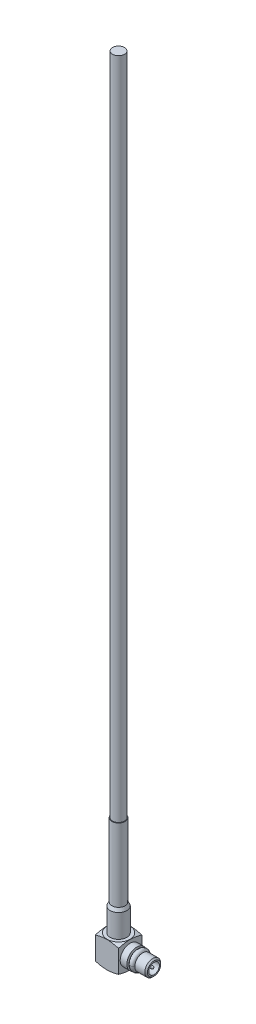
ISO-10303-21;
HEADER;
FILE_DESCRIPTION(('STEP AP214'),'2;1');
FILE_NAME('part.step','',(''),(''),'','','');
FILE_SCHEMA(('AUTOMOTIVE_DESIGN { 1 0 10303 214 1 1 1 1 }'));
ENDSEC;
DATA;
#1=APPLICATION_CONTEXT('core data for automotive mechanical design processes');
#2=APPLICATION_PROTOCOL_DEFINITION('international standard','automotive_design',2000,#1);
#3=PRODUCT_CONTEXT('',#1,'mechanical');
#4=PRODUCT('Part','Part','',(#3));
#5=PRODUCT_RELATED_PRODUCT_CATEGORY('part','',(#4));
#6=PRODUCT_DEFINITION_FORMATION('','',#4);
#7=PRODUCT_DEFINITION_CONTEXT('part definition',#1,'design');
#8=PRODUCT_DEFINITION('design','',#6,#7);
#9=PRODUCT_DEFINITION_SHAPE('','',#8);
#10=(LENGTH_UNIT() NAMED_UNIT(*) SI_UNIT(.MILLI.,.METRE.));
#11=(NAMED_UNIT(*) PLANE_ANGLE_UNIT() SI_UNIT($,.RADIAN.));
#12=(NAMED_UNIT(*) SI_UNIT($,.STERADIAN.) SOLID_ANGLE_UNIT());
#13=UNCERTAINTY_MEASURE_WITH_UNIT(LENGTH_MEASURE(1.E-05),#10,'distance_accuracy_value','');
#14=(GEOMETRIC_REPRESENTATION_CONTEXT(3) GLOBAL_UNCERTAINTY_ASSIGNED_CONTEXT((#13)) GLOBAL_UNIT_ASSIGNED_CONTEXT((#10,
#11,#12)) REPRESENTATION_CONTEXT('',''));
#15=CARTESIAN_POINT('',(0.,0.,0.));
#16=DIRECTION('',(0.,0.,1.));
#17=DIRECTION('',(1.,0.,0.));
#18=AXIS2_PLACEMENT_3D('',#15,#16,#17);
#19=CARTESIAN_POINT('',(5.05,2.,0.));
#20=DIRECTION('',(0.,0.,1.));
#21=DIRECTION('',(-1.,0.,0.));
#22=AXIS2_PLACEMENT_3D('',#19,#20,#21);
#23=SPHERICAL_SURFACE('',#22,0.2);
#24=CARTESIAN_POINT('',(5.05,2.,0.));
#25=DIRECTION('',(-1.,0.,0.));
#26=DIRECTION('',(0.,0.,1.));
#27=AXIS2_PLACEMENT_3D('',#24,#25,#26);
#28=CIRCLE('',#27,0.2);
#29=CARTESIAN_POINT('',(5.05,1.99999999993847,-0.2));
#30=VERTEX_POINT('',#29);
#31=CARTESIAN_POINT('',(5.05,1.99999999999102,0.2));
#32=VERTEX_POINT('',#31);
#33=EDGE_CURVE('E262',#30,#32,#28,.F.);
#34=ORIENTED_EDGE('',*,*,#33,.T.);
#35=CARTESIAN_POINT('',(5.05,2.,0.));
#36=DIRECTION('',(-1.,0.,0.));
#37=DIRECTION('',(0.,0.,1.));
#38=AXIS2_PLACEMENT_3D('',#35,#36,#37);
#39=CIRCLE('',#38,0.2);
#40=EDGE_CURVE('E150',#32,#30,#39,.F.);
#41=ORIENTED_EDGE('',*,*,#40,.T.);
#42=EDGE_LOOP('',(#34,#41));
#43=FACE_BOUND('',#42,.T.);
#44=ADVANCED_FACE('F17',(#43),#23,.T.);
#45=CARTESIAN_POINT('',(5.05,2.,0.));
#46=DIRECTION('',(-1.,0.,0.));
#47=DIRECTION('',(0.,-1.,0.));
#48=AXIS2_PLACEMENT_3D('',#45,#46,#47);
#49=CYLINDRICAL_SURFACE('',#48,0.2);
#50=CARTESIAN_POINT('',(3.85,2.,0.));
#51=DIRECTION('',(-1.,0.,0.));
#52=DIRECTION('',(0.,-1.,0.));
#53=AXIS2_PLACEMENT_3D('',#50,#51,#52);
#54=CIRCLE('',#53,0.2);
#55=CARTESIAN_POINT('',(3.85,1.8,0.));
#56=VERTEX_POINT('',#55);
#57=EDGE_CURVE('E21',#56,#56,#54,.T.);
#58=ORIENTED_EDGE('',*,*,#57,.F.);
#59=EDGE_LOOP('',(#58));
#60=FACE_BOUND('',#59,.T.);
#61=ORIENTED_EDGE('',*,*,#33,.F.);
#62=ORIENTED_EDGE('',*,*,#40,.F.);
#63=EDGE_LOOP('',(#61,#62));
#64=FACE_BOUND('',#63,.T.);
#65=ADVANCED_FACE('F156',(#60,#64),#49,.T.);
#66=CARTESIAN_POINT('',(3.85,1.1904,0.8096));
#67=DIRECTION('',(1.,0.,0.));
#68=DIRECTION('',(0.,0.,-1.));
#69=AXIS2_PLACEMENT_3D('',#66,#67,#68);
#70=PLANE('',#69);
#71=ORIENTED_EDGE('',*,*,#57,.T.);
#72=EDGE_LOOP('',(#71));
#73=FACE_BOUND('',#72,.T.);
#74=CARTESIAN_POINT('',(3.85,2.,0.));
#75=DIRECTION('',(1.,0.,0.));
#76=DIRECTION('',(0.,1.,0.));
#77=AXIS2_PLACEMENT_3D('',#74,#75,#76);
#78=CIRCLE('',#77,0.8);
#79=CARTESIAN_POINT('',(3.85,2.8,0.));
#80=VERTEX_POINT('',#79);
#81=EDGE_CURVE('E269',#80,#80,#78,.F.);
#82=ORIENTED_EDGE('',*,*,#81,.F.);
#83=EDGE_LOOP('',(#82));
#84=FACE_BOUND('',#83,.T.);
#85=ADVANCED_FACE('F159',(#73,#84),#70,.T.);
#86=CARTESIAN_POINT('',(3.85,2.,0.));
#87=DIRECTION('',(1.,0.,0.));
#88=DIRECTION('',(0.,1.,0.));
#89=AXIS2_PLACEMENT_3D('',#86,#87,#88);
#90=CYLINDRICAL_SURFACE('',#89,0.8);
#91=CARTESIAN_POINT('',(5.35,2.,0.));
#92=DIRECTION('',(1.,0.,0.));
#93=DIRECTION('',(0.,1.,0.));
#94=AXIS2_PLACEMENT_3D('',#91,#92,#93);
#95=CIRCLE('',#94,0.8);
#96=CARTESIAN_POINT('',(5.35,2.8,0.));
#97=VERTEX_POINT('',#96);
#98=EDGE_CURVE('E534',#97,#97,#95,.F.);
#99=ORIENTED_EDGE('',*,*,#98,.F.);
#100=EDGE_LOOP('',(#99));
#101=FACE_BOUND('',#100,.T.);
#102=ORIENTED_EDGE('',*,*,#81,.T.);
#103=EDGE_LOOP('',(#102));
#104=FACE_BOUND('',#103,.T.);
#105=ADVANCED_FACE('F162',(#101,#104),#90,.F.);
#106=CARTESIAN_POINT('',(5.35,0.988,1.012));
#107=DIRECTION('',(1.,0.,0.));
#108=DIRECTION('',(0.,0.,-1.));
#109=AXIS2_PLACEMENT_3D('',#106,#107,#108);
#110=PLANE('',#109);
#111=ORIENTED_EDGE('',*,*,#98,.T.);
#112=EDGE_LOOP('',(#111));
#113=FACE_BOUND('',#112,.T.);
#114=CARTESIAN_POINT('',(5.34999999999997,2.,0.));
#115=DIRECTION('',(-1.,0.,0.));
#116=DIRECTION('',(0.,0.,1.));
#117=AXIS2_PLACEMENT_3D('',#114,#115,#116);
#118=CIRCLE('',#117,1.00000000000003);
#119=CARTESIAN_POINT('',(5.34999999999997,2.,1.00000000000003));
#120=VERTEX_POINT('',#119);
#121=EDGE_CURVE('E147',#120,#120,#118,.F.);
#122=ORIENTED_EDGE('',*,*,#121,.T.);
#123=EDGE_LOOP('',(#122));
#124=FACE_BOUND('',#123,.T.);
#125=ADVANCED_FACE('F164',(#113,#124),#110,.T.);
#126=CARTESIAN_POINT('',(5.35,2.,0.));
#127=DIRECTION('',(-1.,0.,0.));
#128=DIRECTION('',(0.,0.,1.));
#129=AXIS2_PLACEMENT_3D('',#126,#127,#128);
#130=CONICAL_SURFACE('',#129,1.,0.785398163397447);
#131=ORIENTED_EDGE('',*,*,#121,.F.);
#132=EDGE_LOOP('',(#131));
#133=FACE_BOUND('',#132,.T.);
#134=CARTESIAN_POINT('',(5.15,2.,0.));
#135=DIRECTION('',(-1.,0.,0.));
#136=DIRECTION('',(0.,0.,1.));
#137=AXIS2_PLACEMENT_3D('',#134,#135,#136);
#138=CIRCLE('',#137,1.2);
#139=CARTESIAN_POINT('',(5.15,2.,1.2));
#140=VERTEX_POINT('',#139);
#141=EDGE_CURVE('E143',#140,#140,#138,.F.);
#142=ORIENTED_EDGE('',*,*,#141,.T.);
#143=EDGE_LOOP('',(#142));
#144=FACE_BOUND('',#143,.T.);
#145=ADVANCED_FACE('F167',(#133,#144),#130,.T.);
#146=CARTESIAN_POINT('',(5.15,2.,0.));
#147=DIRECTION('',(-1.,0.,0.));
#148=DIRECTION('',(0.,-1.,0.));
#149=AXIS2_PLACEMENT_3D('',#146,#147,#148);
#150=CYLINDRICAL_SURFACE('',#149,1.2);
#151=ORIENTED_EDGE('',*,*,#141,.F.);
#152=EDGE_LOOP('',(#151));
#153=FACE_BOUND('',#152,.T.);
#154=CARTESIAN_POINT('',(3.65,2.,0.));
#155=DIRECTION('',(-1.,0.,0.));
#156=DIRECTION('',(0.,-1.,0.));
#157=AXIS2_PLACEMENT_3D('',#154,#155,#156);
#158=CIRCLE('',#157,1.2);
#159=CARTESIAN_POINT('',(3.65,0.8,0.));
#160=VERTEX_POINT('',#159);
#161=EDGE_CURVE('E146',#160,#160,#158,.F.);
#162=ORIENTED_EDGE('',*,*,#161,.T.);
#163=EDGE_LOOP('',(#162));
#164=FACE_BOUND('',#163,.T.);
#165=ADVANCED_FACE('F173',(#153,#164),#150,.T.);
#166=CARTESIAN_POINT('',(3.65,0.7856,1.2144));
#167=DIRECTION('',(1.,0.,0.));
#168=DIRECTION('',(0.,0.,-1.));
#169=AXIS2_PLACEMENT_3D('',#166,#167,#168);
#170=PLANE('',#169);
#171=CARTESIAN_POINT('',(3.65,2.,0.));
#172=DIRECTION('',(-1.,0.,0.));
#173=DIRECTION('',(0.,0.,1.));
#174=AXIS2_PLACEMENT_3D('',#171,#172,#173);
#175=CIRCLE('',#174,1.);
#176=CARTESIAN_POINT('',(3.65,2.,1.));
#177=VERTEX_POINT('',#176);
#178=EDGE_CURVE('E136',#177,#177,#175,.F.);
#179=ORIENTED_EDGE('',*,*,#178,.T.);
#180=EDGE_LOOP('',(#179));
#181=FACE_BOUND('',#180,.T.);
#182=ORIENTED_EDGE('',*,*,#161,.F.);
#183=EDGE_LOOP('',(#182));
#184=FACE_BOUND('',#183,.T.);
#185=ADVANCED_FACE('F169',(#181,#184),#170,.F.);
#186=CARTESIAN_POINT('',(3.65,2.,0.));
#187=DIRECTION('',(-1.,0.,0.));
#188=DIRECTION('',(0.,0.,1.));
#189=AXIS2_PLACEMENT_3D('',#186,#187,#188);
#190=CYLINDRICAL_SURFACE('',#189,1.);
#191=CARTESIAN_POINT('',(3.56918829912818,2.,0.));
#192=DIRECTION('',(-1.,0.,0.));
#193=DIRECTION('',(0.,-1.,0.));
#194=AXIS2_PLACEMENT_3D('',#191,#192,#193);
#195=CIRCLE('',#194,1.00000000011661);
#196=CARTESIAN_POINT('',(3.56918829909613,2.,1.00000000008745));
#197=VERTEX_POINT('',#196);
#198=CARTESIAN_POINT('',(3.56918829909613,1.99999999989745,-1.00000000008745));
#199=VERTEX_POINT('',#198);
#200=EDGE_CURVE('E111',#197,#199,#195,.T.);
#201=ORIENTED_EDGE('',*,*,#200,.F.);
#202=CARTESIAN_POINT('',(3.56918829912818,2.,0.));
#203=DIRECTION('',(-1.,0.,0.));
#204=DIRECTION('',(0.,-1.,0.));
#205=AXIS2_PLACEMENT_3D('',#202,#203,#204);
#206=CIRCLE('',#205,1.00000000011661);
#207=EDGE_CURVE('E130',#199,#197,#206,.T.);
#208=ORIENTED_EDGE('',*,*,#207,.F.);
#209=EDGE_LOOP('',(#201,#208));
#210=FACE_BOUND('',#209,.T.);
#211=ORIENTED_EDGE('',*,*,#178,.F.);
#212=EDGE_LOOP('',(#211));
#213=FACE_BOUND('',#212,.T.);
#214=ADVANCED_FACE('F172',(#210,#213),#190,.T.);
#215=CARTESIAN_POINT('',(2.841641112,2.,-0.963592296));
#216=CARTESIAN_POINT('',(2.841641112,0.072815408,-0.963592296));
#217=CARTESIAN_POINT('',(2.841641112,0.072815408,0.963592296));
#218=CARTESIAN_POINT('',(2.841641112,2.,0.963592296));
#219=CARTESIAN_POINT('',(2.745890609,2.,-1.235039707));
#220=CARTESIAN_POINT('',(2.745890609,-0.470079413,-1.235039707));
#221=CARTESIAN_POINT('',(2.745890609,-0.470079413,1.235039707));
#222=CARTESIAN_POINT('',(2.745890609,2.,1.235039707));
#223=CARTESIAN_POINT('',(2.912160017,2.,-1.47));
#224=CARTESIAN_POINT('',(2.912160017,-0.94,-1.47));
#225=CARTESIAN_POINT('',(2.912160017,-0.94,1.47));
#226=CARTESIAN_POINT('',(2.912160017,2.,1.47));
#227=CARTESIAN_POINT('',(3.2,2.,-1.47));
#228=CARTESIAN_POINT('',(3.2,-0.94,-1.47));
#229=CARTESIAN_POINT('',(3.2,-0.94,1.47));
#230=CARTESIAN_POINT('',(3.2,2.,1.47));
#231=CARTESIAN_POINT('',(3.487839983,2.,-1.47));
#232=CARTESIAN_POINT('',(3.487839983,-0.94,-1.47));
#233=CARTESIAN_POINT('',(3.487839983,-0.94,1.47));
#234=CARTESIAN_POINT('',(3.487839983,2.,1.47));
#235=CARTESIAN_POINT('',(3.654109391,2.,-1.235039707));
#236=CARTESIAN_POINT('',(3.654109391,-0.470079413,-1.235039707));
#237=CARTESIAN_POINT('',(3.654109391,-0.470079413,1.235039707));
#238=CARTESIAN_POINT('',(3.654109391,2.,1.235039707));
#239=CARTESIAN_POINT('',(3.558358888,2.,-0.963592296));
#240=CARTESIAN_POINT('',(3.558358888,0.072815408,-0.963592296));
#241=CARTESIAN_POINT('',(3.558358888,0.072815408,0.963592296));
#242=CARTESIAN_POINT('',(3.558358888,2.,0.963592296));
#243=(BOUNDED_SURFACE() B_SPLINE_SURFACE(3,3,((#215,#216,#217,#218),(#219,#220,#221,#222),(#223,
#224,#225,#226),(#227,#228,#229,#230),(#231,#232,#233,#234),(#235,#236,#237,#238),(#239,#240,
#241,#242)),.UNSPECIFIED.,.F.,.F.,.F.) B_SPLINE_SURFACE_WITH_KNOTS((4,3,4),(4,4),(0.,0.5,1.),
(0.,1.),.UNSPECIFIED.) GEOMETRIC_REPRESENTATION_ITEM() RATIONAL_B_SPLINE_SURFACE(((1.,
0.333333333333333,0.333333333333333,1.),(0.71843018897567,0.239476729658557,0.239476729658557,
0.71843018897567),(0.71843018897567,0.239476729658557,0.239476729658557,0.71843018897567),(1.,
0.333333333333333,0.333333333333333,1.),(0.71843018897567,0.239476729658557,0.239476729658557,
0.71843018897567),(0.71843018897567,0.239476729658557,0.239476729658557,0.71843018897567),(1.,
0.333333333333333,0.333333333333333,1.))) REPRESENTATION_ITEM('') SURFACE());
#244=CARTESIAN_POINT('',(2.841641112,2.,0.963592296));
#245=CARTESIAN_POINT('',(2.745890609,2.,1.235039707));
#246=CARTESIAN_POINT('',(2.912160017,2.,1.47));
#247=CARTESIAN_POINT('',(3.2,2.,1.47));
#248=CARTESIAN_POINT('',(3.487839983,2.,1.47));
#249=CARTESIAN_POINT('',(3.654109391,2.,1.235039707));
#250=CARTESIAN_POINT('',(3.558358888,2.,0.963592296));
#251=(BOUNDED_CURVE() B_SPLINE_CURVE(3,(#244,#245,#246,#247,#248,#249,#250),.UNSPECIFIED.,.F.,
.F.) B_SPLINE_CURVE_WITH_KNOTS((4,3,4),(0.,0.5,1.),
.UNSPECIFIED.) CURVE() GEOMETRIC_REPRESENTATION_ITEM() RATIONAL_B_SPLINE_CURVE((1.,
0.71843018897567,0.71843018897567,1.,0.71843018897567,0.71843018897567,1.)) REPRESENTATION_ITEM(''));
#252=CARTESIAN_POINT('',(2.83081170097646,1.9999999999551,0.999999999994262));
#253=VERTEX_POINT('',#252);
#254=EDGE_CURVE('E105',#253,#197,#251,.T.);
#255=CARTESIAN_POINT('',(2.830811701,2.,0.));
#256=DIRECTION('',(-1.,0.,0.));
#257=DIRECTION('',(0.,0.,1.));
#258=AXIS2_PLACEMENT_3D('',#255,#256,#257);
#259=CIRCLE('',#258,1.);
#260=CARTESIAN_POINT('',(2.83081170097646,1.99999999969234,-0.999999999994262));
#261=VERTEX_POINT('',#260);
#262=EDGE_CURVE('E101',#253,#261,#259,.F.);
#263=CARTESIAN_POINT('',(2.841641112,2.,-0.963592296));
#264=CARTESIAN_POINT('',(2.745890609,2.,-1.235039707));
#265=CARTESIAN_POINT('',(2.912160017,2.,-1.47));
#266=CARTESIAN_POINT('',(3.2,2.,-1.47));
#267=CARTESIAN_POINT('',(3.487839983,2.,-1.47));
#268=CARTESIAN_POINT('',(3.654109391,2.,-1.235039707));
#269=CARTESIAN_POINT('',(3.558358888,2.,-0.963592296));
#270=(BOUNDED_CURVE() B_SPLINE_CURVE(3,(#263,#264,#265,#266,#267,#268,#269),.UNSPECIFIED.,.F.,
.F.) B_SPLINE_CURVE_WITH_KNOTS((4,3,4),(0.,0.5,1.),
.UNSPECIFIED.) CURVE() GEOMETRIC_REPRESENTATION_ITEM() RATIONAL_B_SPLINE_CURVE((1.,
0.71843018897567,0.71843018897567,1.,0.71843018897567,0.71843018897567,1.)) REPRESENTATION_ITEM(''));
#271=EDGE_CURVE('E108',#199,#261,#270,.F.);
#272=ORIENTED_EDGE('',*,*,#254,.F.);
#273=ORIENTED_EDGE('',*,*,#262,.T.);
#274=ORIENTED_EDGE('',*,*,#271,.F.);
#275=ORIENTED_EDGE('',*,*,#207,.T.);
#276=EDGE_LOOP('',(#272,#273,#274,#275));
#277=FACE_BOUND('',#276,.T.);
#278=ADVANCED_FACE('F430',(#277),#243,.T.);
#279=CARTESIAN_POINT('',(2.841641112,2.,0.963592296));
#280=CARTESIAN_POINT('',(2.841641112,3.927184592,0.963592296));
#281=CARTESIAN_POINT('',(2.841641112,3.927184592,-0.963592296));
#282=CARTESIAN_POINT('',(2.841641112,2.,-0.963592296));
#283=CARTESIAN_POINT('',(2.745890609,2.,1.235039707));
#284=CARTESIAN_POINT('',(2.745890609,4.470079413,1.235039707));
#285=CARTESIAN_POINT('',(2.745890609,4.470079413,-1.235039707));
#286=CARTESIAN_POINT('',(2.745890609,2.,-1.235039707));
#287=CARTESIAN_POINT('',(2.912160017,2.,1.47));
#288=CARTESIAN_POINT('',(2.912160017,4.94,1.47));
#289=CARTESIAN_POINT('',(2.912160017,4.94,-1.47));
#290=CARTESIAN_POINT('',(2.912160017,2.,-1.47));
#291=CARTESIAN_POINT('',(3.2,2.,1.47));
#292=CARTESIAN_POINT('',(3.2,4.94,1.47));
#293=CARTESIAN_POINT('',(3.2,4.94,-1.47));
#294=CARTESIAN_POINT('',(3.2,2.,-1.47));
#295=CARTESIAN_POINT('',(3.487839983,2.,1.47));
#296=CARTESIAN_POINT('',(3.487839983,4.94,1.47));
#297=CARTESIAN_POINT('',(3.487839983,4.94,-1.47));
#298=CARTESIAN_POINT('',(3.487839983,2.,-1.47));
#299=CARTESIAN_POINT('',(3.654109391,2.,1.235039707));
#300=CARTESIAN_POINT('',(3.654109391,4.470079413,1.235039707));
#301=CARTESIAN_POINT('',(3.654109391,4.470079413,-1.235039707));
#302=CARTESIAN_POINT('',(3.654109391,2.,-1.235039707));
#303=CARTESIAN_POINT('',(3.558358888,2.,0.963592296));
#304=CARTESIAN_POINT('',(3.558358888,3.927184592,0.963592296));
#305=CARTESIAN_POINT('',(3.558358888,3.927184592,-0.963592296));
#306=CARTESIAN_POINT('',(3.558358888,2.,-0.963592296));
#307=(BOUNDED_SURFACE() B_SPLINE_SURFACE(3,3,((#279,#280,#281,#282),(#283,#284,#285,#286),(#287,
#288,#289,#290),(#291,#292,#293,#294),(#295,#296,#297,#298),(#299,#300,#301,#302),(#303,#304,
#305,#306)),.UNSPECIFIED.,.F.,.F.,.F.) B_SPLINE_SURFACE_WITH_KNOTS((4,3,4),(4,4),(0.,0.5,1.),
(0.,1.),.UNSPECIFIED.) GEOMETRIC_REPRESENTATION_ITEM() RATIONAL_B_SPLINE_SURFACE(((1.,
0.333333333333333,0.333333333333333,1.),(0.71843018897567,0.239476729658557,0.239476729658557,
0.71843018897567),(0.71843018897567,0.239476729658557,0.239476729658557,0.71843018897567),(1.,
0.333333333333333,0.333333333333333,1.),(0.71843018897567,0.239476729658557,0.239476729658557,
0.71843018897567),(0.71843018897567,0.239476729658557,0.239476729658557,0.71843018897567),(1.,
0.333333333333333,0.333333333333333,1.))) REPRESENTATION_ITEM('') SURFACE());
#308=CARTESIAN_POINT('',(2.830811701,2.,0.));
#309=DIRECTION('',(-1.,0.,0.));
#310=DIRECTION('',(0.,0.,1.));
#311=AXIS2_PLACEMENT_3D('',#308,#309,#310);
#312=CIRCLE('',#311,1.);
#313=EDGE_CURVE('E104',#261,#253,#312,.F.);
#314=ORIENTED_EDGE('',*,*,#313,.T.);
#315=ORIENTED_EDGE('',*,*,#254,.T.);
#316=ORIENTED_EDGE('',*,*,#200,.T.);
#317=ORIENTED_EDGE('',*,*,#271,.T.);
#318=EDGE_LOOP('',(#314,#315,#316,#317));
#319=FACE_BOUND('',#318,.T.);
#320=ADVANCED_FACE('F422',(#319),#307,.T.);
#321=CARTESIAN_POINT('',(2.830811701,2.,0.));
#322=DIRECTION('',(-1.,0.,0.));
#323=DIRECTION('',(0.,0.,1.));
#324=AXIS2_PLACEMENT_3D('',#321,#322,#323);
#325=CYLINDRICAL_SURFACE('',#324,1.);
#326=CARTESIAN_POINT('',(2.75,2.,0.));
#327=DIRECTION('',(-1.,0.,0.));
#328=DIRECTION('',(0.,0.,1.));
#329=AXIS2_PLACEMENT_3D('',#326,#327,#328);
#330=CIRCLE('',#329,1.);
#331=CARTESIAN_POINT('',(2.75,2.,1.));
#332=VERTEX_POINT('',#331);
#333=EDGE_CURVE('E121',#332,#332,#330,.T.);
#334=ORIENTED_EDGE('',*,*,#333,.F.);
#335=EDGE_LOOP('',(#334));
#336=FACE_BOUND('',#335,.T.);
#337=ORIENTED_EDGE('',*,*,#313,.F.);
#338=ORIENTED_EDGE('',*,*,#262,.F.);
#339=EDGE_LOOP('',(#337,#338));
#340=FACE_BOUND('',#339,.T.);
#341=ADVANCED_FACE('F179',(#336,#340),#325,.T.);
#342=CARTESIAN_POINT('',(2.75,0.482,1.518));
#343=DIRECTION('',(1.,0.,0.));
#344=DIRECTION('',(0.,0.,-1.));
#345=AXIS2_PLACEMENT_3D('',#342,#343,#344);
#346=PLANE('',#345);
#347=ORIENTED_EDGE('',*,*,#333,.T.);
#348=EDGE_LOOP('',(#347));
#349=FACE_BOUND('',#348,.T.);
#350=CARTESIAN_POINT('',(2.75,2.,0.));
#351=DIRECTION('',(-1.,0.,0.));
#352=DIRECTION('',(0.,0.,1.));
#353=AXIS2_PLACEMENT_3D('',#350,#351,#352);
#354=CIRCLE('',#353,1.5);
#355=CARTESIAN_POINT('',(2.75,2.,1.5));
#356=VERTEX_POINT('',#355);
#357=EDGE_CURVE('E547',#356,#356,#354,.F.);
#358=ORIENTED_EDGE('',*,*,#357,.T.);
#359=EDGE_LOOP('',(#358));
#360=FACE_BOUND('',#359,.T.);
#361=ADVANCED_FACE('F175',(#349,#360),#346,.T.);
#362=CARTESIAN_POINT('',(-1.745572219,0.,-1.745572219));
#363=DIRECTION('',(0.,1.,0.));
#364=DIRECTION('',(0.,0.,1.));
#365=AXIS2_PLACEMENT_3D('',#362,#363,#364);
#366=PLANE('',#365);
#367=CARTESIAN_POINT('',(0.,-4.18998275203259E-10,0.));
#368=DIRECTION('',(0.,1.,0.));
#369=DIRECTION('',(0.,0.,1.));
#370=AXIS2_PLACEMENT_3D('',#367,#368,#369);
#371=CIRCLE('',#370,1.72487373429371);
#372=CARTESIAN_POINT('',(0.,-4.18998275203259E-10,1.72487373429371));
#373=VERTEX_POINT('',#372);
#374=EDGE_CURVE('E81',#373,#373,#371,.F.);
#375=ORIENTED_EDGE('',*,*,#374,.T.);
#376=EDGE_LOOP('',(#375));
#377=FACE_BOUND('',#376,.T.);
#378=ADVANCED_FACE('F178',(#377),#366,.F.);
#379=CARTESIAN_POINT('',(2.75,2.,0.));
#380=DIRECTION('',(-1.,0.,0.));
#381=DIRECTION('',(0.,0.,1.));
#382=AXIS2_PLACEMENT_3D('',#379,#380,#381);
#383=CYLINDRICAL_SURFACE('',#382,1.5);
#384=ORIENTED_EDGE('',*,*,#357,.F.);
#385=EDGE_LOOP('',(#384));
#386=FACE_BOUND('',#385,.T.);
#387=CARTESIAN_POINT('',(1.75,2.,0.));
#388=DIRECTION('',(-1.,0.,0.));
#389=DIRECTION('',(0.,0.,1.));
#390=AXIS2_PLACEMENT_3D('',#387,#388,#389);
#391=CIRCLE('',#390,1.5);
#392=CARTESIAN_POINT('',(1.75,2.,1.5));
#393=VERTEX_POINT('',#392);
#394=EDGE_CURVE('E95',#393,#393,#391,.F.);
#395=ORIENTED_EDGE('',*,*,#394,.T.);
#396=EDGE_LOOP('',(#395));
#397=FACE_BOUND('',#396,.T.);
#398=ADVANCED_FACE('F183',(#386,#397),#383,.T.);
#399=CARTESIAN_POINT('',(0.,-4.18991162836994E-10,0.));
#400=DIRECTION('',(0.,1.,0.));
#401=DIRECTION('',(0.,0.,1.));
#402=AXIS2_PLACEMENT_3D('',#399,#400,#401);
#403=CONICAL_SURFACE('',#402,1.72487373429373,1.19028994906997);
#404=CARTESIAN_POINT('',(-1.75000000005264,0.300000000001926,1.74999999995095));
#405=CARTESIAN_POINT('',(-1.75000000001891,0.277343892377994,1.66984025484135));
#406=CARTESIAN_POINT('',(-1.75000000000507,0.255376495742548,1.58947507055314));
#407=CARTESIAN_POINT('',(-1.74999999999493,0.213250057796904,1.42822964975774));
#408=CARTESIAN_POINT('',(-1.74999999999864,0.193091953293528,1.34734916938965));
#409=CARTESIAN_POINT('',(-1.75000000000137,0.154929292887335,1.18458232255644));
#410=CARTESIAN_POINT('',(-1.75000000000037,0.136937858724414,1.10269284413399));
#411=CARTESIAN_POINT('',(-1.74999999999963,0.103820651591177,0.938340482380735));
#412=CARTESIAN_POINT('',(-1.7499999999999,0.0886945065931123,0.855877674934067));
#413=CARTESIAN_POINT('',(-1.75000000000009,0.0623358238787216,0.692802059846125));
#414=CARTESIAN_POINT('',(-1.75000000000003,0.0510021973246043,0.612205832563477));
#415=CARTESIAN_POINT('',(-1.74999999999998,0.0322176998984324,0.450564347562989));
#416=CARTESIAN_POINT('',(-1.74999999999999,0.0247663273961863,0.36951914922551));
#417=CARTESIAN_POINT('',(-1.75000000000001,0.0142241930304569,0.207366130271185));
#418=CARTESIAN_POINT('',(-1.75,0.0111213074862501,0.126259117092636));
#419=CARTESIAN_POINT('',(-1.75,0.00944519765535009,-0.0359956845704734));
#420=CARTESIAN_POINT('',(-1.75,0.010871770195776,-0.117143471062859));
#421=CARTESIAN_POINT('',(-1.75,0.0203844175750047,-0.328165376810296));
#422=CARTESIAN_POINT('',(-1.75,0.0319700791483235,-0.457889301824149));
#423=CARTESIAN_POINT('',(-1.75,0.0648175785507928,-0.716321982760633));
#424=CARTESIAN_POINT('',(-1.75,0.0861005791351572,-0.84502788877007));
#425=CARTESIAN_POINT('',(-1.75,0.13646744692654,-1.10417382883707));
#426=CARTESIAN_POINT('',(-1.75,0.165731382352873,-1.23457791882599));
#427=CARTESIAN_POINT('',(-1.75,0.213527538837027,-1.42890603289927));
#428=CARTESIAN_POINT('',(-1.75,0.230070706517323,-1.49333466666709));
#429=CARTESIAN_POINT('',(-1.75,0.264259350602957,-1.62188453921529));
#430=CARTESIAN_POINT('',(-1.75,0.281904588452892,-1.6860058413076));
#431=CARTESIAN_POINT('',(-1.75,0.300000000043209,-1.74999999994909));
#432=B_SPLINE_CURVE_WITH_KNOTS('',3,(#404,#405,#406,#407,#408,#409,#410,#411,#412,#413,#414,
#415,#416,#417,#418,#419,#420,#421,#422,#423,#424,#425,#426,#427,#428,#429,#430,#431),
.UNSPECIFIED.,.F.,.F.,(4,2,2,2,2,2,2,2,2,2,2,2,2,4),(0.,0.249912407687991,0.49995347625099,
0.751439863802241,1.00289357606844,1.24698038116211,1.49103563971256,1.73440910374937,
1.97777165120669,2.368011002196,2.75910609209306,3.15988275266041,3.3594320302765,
3.55893826192699),.UNSPECIFIED.);
#433=CARTESIAN_POINT('',(-1.74999999997,0.300000000040639,1.74999999997));
#434=VERTEX_POINT('',#433);
#435=CARTESIAN_POINT('',(-1.75,0.300000000049124,-1.74999999997));
#436=VERTEX_POINT('',#435);
#437=EDGE_CURVE('E65',#434,#436,#432,.T.);
#438=ORIENTED_EDGE('',*,*,#437,.T.);
#439=CARTESIAN_POINT('',(-1.74999999995095,0.300000000001926,-1.75000000005264));
#440=CARTESIAN_POINT('',(-1.67792974541954,0.279626464840247,-1.75000000001855));
#441=CARTESIAN_POINT('',(-1.60569506989051,0.259814745862892,-1.75000000000489));
#442=CARTESIAN_POINT('',(-1.46082353166753,0.22162068302558,-1.74999999999511));
#443=CARTESIAN_POINT('',(-1.3881865402013,0.203238828992467,-1.74999999999901));
#444=CARTESIAN_POINT('',(-1.24209996919839,0.168131764033121,-1.750000000001));
#445=CARTESIAN_POINT('',(-1.16864812329131,0.151415850823692,-1.74999999999907));
#446=CARTESIAN_POINT('',(-1.02129642298288,0.120150310511673,-1.75000000000093));
#447=CARTESIAN_POINT('',(-0.947396606838389,0.105600501061431,-1.75000000000471));
#448=CARTESIAN_POINT('',(-0.728968254578805,0.0665997488608526,-1.74999999999083));
#449=CARTESIAN_POINT('',(-0.583732590608136,0.0457964427955599,-1.74999999994949));
#450=CARTESIAN_POINT('',(-0.365112061457696,0.0245634651551529,-1.75000000002519));
#451=CARTESIAN_POINT('',(-0.292198742584532,0.0191483468448058,-1.75000000007324));
#452=CARTESIAN_POINT('',(-0.146190278663107,0.0118919227861608,-1.74999999992676));
#453=CARTESIAN_POINT('',(-0.0730951393315535,0.0100505060626468,-1.74999999973225));
#454=CARTESIAN_POINT('',(0.0730951393320002,0.0100505060626493,-1.74999999973225));
#455=CARTESIAN_POINT('',(0.146190278664,0.0118919227861882,-1.74999999992676));
#456=CARTESIAN_POINT('',(0.292198742586306,0.0191483468449109,-1.75000000007325));
#457=CARTESIAN_POINT('',(0.365112061459907,0.0245634651553102,-1.75000000002522));
#458=CARTESIAN_POINT('',(0.583732590611608,0.0457964427960117,-1.74999999994945));
#459=CARTESIAN_POINT('',(0.72896825458307,0.066599748861685,-1.74999999999058));
#460=CARTESIAN_POINT('',(0.94739660684399,0.105600501062395,-1.75000000000484));
#461=CARTESIAN_POINT('',(1.02129642298896,0.120150310512606,-1.7500000000013));
#462=CARTESIAN_POINT('',(1.16864812329805,0.151415850825481,-1.7499999999987));
#463=CARTESIAN_POINT('',(1.24209996920531,0.168131764035795,-1.74999999999963));
#464=CARTESIAN_POINT('',(1.38818654020958,0.203238828993451,-1.75000000000037));
#465=CARTESIAN_POINT('',(1.46082353167702,0.221620683024008,-1.75000000000018));
#466=CARTESIAN_POINT('',(1.60569506989897,0.259814745869191,-1.74999999999982));
#467=CARTESIAN_POINT('',(1.67792974542577,0.27962646485697,-1.74999999999963));
#468=CARTESIAN_POINT('',(1.74999999995095,0.300000000043736,-1.75));
#469=B_SPLINE_CURVE_WITH_KNOTS('',3,(#439,#440,#441,#442,#443,#444,#445,#446,#447,#448,#449,
#450,#451,#452,#453,#454,#455,#456,#457,#458,#459,#460,#461,#462,#463,#464,#465,#466,#467,#468),
.UNSPECIFIED.,.F.,.F.,(4,2,2,2,2,2,2,2,2,2,2,2,2,2,4),(0.,0.224689074690876,0.449454784894143,
0.675411894431164,0.901349971604272,1.34093894268624,1.56020735988023,1.77946896795803,
1.99873057603718,2.21799899323247,2.65758796431701,2.88352604149149,3.1094831510297,
3.3342488612344,3.5589379359271),.UNSPECIFIED.);
#470=CARTESIAN_POINT('',(1.74999999997,0.300000000049124,-1.75));
#471=VERTEX_POINT('',#470);
#472=EDGE_CURVE('E99',#436,#471,#469,.T.);
#473=ORIENTED_EDGE('',*,*,#472,.T.);
#474=CARTESIAN_POINT('',(1.75000000005264,0.300000000001926,-1.74999999995095));
#475=CARTESIAN_POINT('',(1.75000000001891,0.277343892377994,-1.66984025484135));
#476=CARTESIAN_POINT('',(1.75000000000507,0.255376495742548,-1.58947507055314));
#477=CARTESIAN_POINT('',(1.74999999999493,0.213250057796904,-1.42822964975774));
#478=CARTESIAN_POINT('',(1.74999999999864,0.193091953293528,-1.34734916938965));
#479=CARTESIAN_POINT('',(1.75000000000137,0.154929292887335,-1.18458232255644));
#480=CARTESIAN_POINT('',(1.75000000000037,0.136937858724414,-1.10269284413399));
#481=CARTESIAN_POINT('',(1.74999999999963,0.103820651591177,-0.938340482380735));
#482=CARTESIAN_POINT('',(1.7499999999999,0.0886945065931123,-0.855877674934067));
#483=CARTESIAN_POINT('',(1.75000000000009,0.0623358238787216,-0.692802059846125));
#484=CARTESIAN_POINT('',(1.75000000000003,0.0510021973246043,-0.612205832563477));
#485=CARTESIAN_POINT('',(1.74999999999998,0.0322176998984324,-0.450564347562989));
#486=CARTESIAN_POINT('',(1.74999999999999,0.0247663273961863,-0.36951914922551));
#487=CARTESIAN_POINT('',(1.75000000000001,0.0142241930304569,-0.207366130271185));
#488=CARTESIAN_POINT('',(1.75,0.0111213074862501,-0.126259117092636));
#489=CARTESIAN_POINT('',(1.75,0.00944519765535009,0.0359956845704734));
#490=CARTESIAN_POINT('',(1.75,0.010871770195776,0.117143471062859));
#491=CARTESIAN_POINT('',(1.75,0.0203844175750047,0.328165376810296));
#492=CARTESIAN_POINT('',(1.75,0.0319700791483235,0.457889301824149));
#493=CARTESIAN_POINT('',(1.75,0.0648175785507928,0.716321982760633));
#494=CARTESIAN_POINT('',(1.75,0.0861005791351572,0.84502788877007));
#495=CARTESIAN_POINT('',(1.75,0.13646744692654,1.10417382883707));
#496=CARTESIAN_POINT('',(1.75,0.165731382352873,1.23457791882599));
#497=CARTESIAN_POINT('',(1.75,0.213527538837027,1.42890603289927));
#498=CARTESIAN_POINT('',(1.75,0.230070706517323,1.49333466666709));
#499=CARTESIAN_POINT('',(1.75,0.264259350602957,1.62188453921529));
#500=CARTESIAN_POINT('',(1.75,0.281904588452892,1.6860058413076));
#501=CARTESIAN_POINT('',(1.75,0.300000000043209,1.74999999994909));
#502=B_SPLINE_CURVE_WITH_KNOTS('',3,(#474,#475,#476,#477,#478,#479,#480,#481,#482,#483,#484,
#485,#486,#487,#488,#489,#490,#491,#492,#493,#494,#495,#496,#497,#498,#499,#500,#501),
.UNSPECIFIED.,.F.,.F.,(4,2,2,2,2,2,2,2,2,2,2,2,2,4),(0.,0.249912407687991,0.49995347625099,
0.751439863802241,1.00289357606844,1.24698038116211,1.49103563971256,1.73440910374937,
1.97777165120669,2.368011002196,2.75910609209306,3.15988275266041,3.3594320302765,
3.55893826192699),.UNSPECIFIED.);
#503=CARTESIAN_POINT('',(1.75,0.300000000049124,1.74999999997));
#504=VERTEX_POINT('',#503);
#505=EDGE_CURVE('E68',#471,#504,#502,.T.);
#506=ORIENTED_EDGE('',*,*,#505,.T.);
#507=CARTESIAN_POINT('',(1.74999999995095,0.300000000001926,1.75000000005264));
#508=CARTESIAN_POINT('',(1.67792974542539,0.279626464841899,1.75000000001855));
#509=CARTESIAN_POINT('',(1.60569506990225,0.259814745866108,1.75000000000489));
#510=CARTESIAN_POINT('',(1.4608235316911,0.221620683031669,1.74999999999511));
#511=CARTESIAN_POINT('',(1.38818654023082,0.203238828999865,1.74999999999901));
#512=CARTESIAN_POINT('',(1.24209996923998,0.168131764042811,1.750000000001));
#513=CARTESIAN_POINT('',(1.168648123339,0.151415850834362,1.74999999999907));
#514=CARTESIAN_POINT('',(1.02129642304286,0.120150310523847,1.75000000000093));
#515=CARTESIAN_POINT('',(0.94739660690455,0.105600501074129,1.75000000000471));
#516=CARTESIAN_POINT('',(0.728968254663011,0.0665997488741756,1.74999999999083));
#517=CARTESIAN_POINT('',(0.583732590704324,0.0457964428081859,1.74999999994949));
#518=CARTESIAN_POINT('',(0.365112061571799,0.0245634651645917,1.75000000002519));
#519=CARTESIAN_POINT('',(0.292198742704581,0.0191483468528282,1.75000000007324));
#520=CARTESIAN_POINT('',(0.146190278794984,0.0118919227906624,1.74999999992676));
#521=CARTESIAN_POINT('',(0.0730951394693095,0.0100505060650442,1.74999999973225));
#522=CARTESIAN_POINT('',(-0.0730951391942441,0.010050506060252,1.74999999973225));
#523=CARTESIAN_POINT('',(-0.146190278532124,0.0118919227816866,1.74999999992676));
#524=CARTESIAN_POINT('',(-0.292198742466257,0.0191483468368885,1.75000000007325));
#525=CARTESIAN_POINT('',(-0.365112061345805,0.0245634651458715,1.75000000002522));
#526=CARTESIAN_POINT('',(-0.583732590515421,0.0457964427833858,1.74999999994945));
#527=CARTESIAN_POINT('',(-0.728968254498864,0.0665997488483619,1.74999999999058));
#528=CARTESIAN_POINT('',(-0.94739660677783,0.105600501049697,1.75000000000484));
#529=CARTESIAN_POINT('',(-1.02129642292898,0.120150310500432,1.7500000000013));
#530=CARTESIAN_POINT('',(-1.16864812325036,0.151415850814811,1.7499999999987));
#531=CARTESIAN_POINT('',(-1.24209996916372,0.168131764026105,1.74999999999963));
#532=CARTESIAN_POINT('',(-1.38818654018006,0.203238828986053,1.75000000000037));
#533=CARTESIAN_POINT('',(-1.46082353165345,0.221620683017919,1.75000000000018));
#534=CARTESIAN_POINT('',(-1.60569506988724,0.259814745865975,1.74999999999982));
#535=CARTESIAN_POINT('',(-1.67792974541992,0.279626464855319,1.74999999999963));
#536=CARTESIAN_POINT('',(-1.74999999995095,0.300000000043736,1.75));
#537=B_SPLINE_CURVE_WITH_KNOTS('',3,(#507,#508,#509,#510,#511,#512,#513,#514,#515,#516,#517,
#518,#519,#520,#521,#522,#523,#524,#525,#526,#527,#528,#529,#530,#531,#532,#533,#534,#535,#536),
.UNSPECIFIED.,.F.,.F.,(4,2,2,2,2,2,2,2,2,2,2,2,2,2,4),(0.,0.224689074672628,0.449454784857616,
0.675411894376135,0.901349971530748,1.34093894257763,1.56020735975417,1.77946896781452,
1.99873057591111,2.21799899312386,2.65758796424349,2.88352604143646,3.10948315099317,
3.33424886121615,3.5589379359271),.UNSPECIFIED.);
#538=EDGE_CURVE('E61',#504,#434,#537,.T.);
#539=ORIENTED_EDGE('',*,*,#538,.T.);
#540=EDGE_LOOP('',(#438,#473,#506,#539));
#541=FACE_BOUND('',#540,.T.);
#542=ORIENTED_EDGE('',*,*,#374,.F.);
#543=EDGE_LOOP('',(#542));
#544=FACE_BOUND('',#543,.T.);
#545=ADVANCED_FACE('F63',(#541,#544),#403,.T.);
#546=CARTESIAN_POINT('',(-1.75,-0.058159022,1.75));
#547=DIRECTION('',(1.,0.,0.));
#548=DIRECTION('',(0.,0.,-1.));
#549=AXIS2_PLACEMENT_3D('',#546,#547,#548);
#550=PLANE('',#549);
#551=ORIENTED_EDGE('',*,*,#437,.F.);
#552=DIRECTION('',(0.,1.,0.));
#553=VECTOR('',#552,1.);
#554=CARTESIAN_POINT('',(-1.75,2.,1.75));
#555=LINE('',#554,#553);
#556=CARTESIAN_POINT('',(-1.74999999998911,3.69999999994547,1.75));
#557=VERTEX_POINT('',#556);
#558=EDGE_CURVE('E71',#434,#557,#555,.T.);
#559=ORIENTED_EDGE('',*,*,#558,.T.);
#560=CARTESIAN_POINT('',(-1.75,3.69999999995323,1.74999999996169));
#561=CARTESIAN_POINT('',(-1.75,3.72265610760218,1.66984025485884));
#562=CARTESIAN_POINT('',(-1.75,3.74462350424799,1.58947507057339));
#563=CARTESIAN_POINT('',(-1.75,3.78674994220143,1.42822964978013));
#564=CARTESIAN_POINT('',(-1.75,3.80690804670222,1.34734916941141));
#565=CARTESIAN_POINT('',(-1.75,3.84507070710673,1.1845823225781));
#566=CARTESIAN_POINT('',(-1.75,3.86306214127056,1.10269284415618));
#567=CARTESIAN_POINT('',(-1.75,3.89617934840476,0.938340482403659));
#568=CARTESIAN_POINT('',(-1.75,3.91130549340289,0.855877674957199));
#569=CARTESIAN_POINT('',(-1.75,3.93766417611766,0.692802059870072));
#570=CARTESIAN_POINT('',(-1.75,3.94899780267212,0.612205832588031));
#571=CARTESIAN_POINT('',(-1.75,3.967782300099,0.450564347588741));
#572=CARTESIAN_POINT('',(-1.75,3.97523367260163,0.369519149251854));
#573=CARTESIAN_POINT('',(-1.75,3.98577580696823,0.207366130298622));
#574=CARTESIAN_POINT('',(-1.75,3.98887869251293,0.126259117120573));
#575=CARTESIAN_POINT('',(-1.75,3.99055480234488,-0.0359956845415842));
#576=CARTESIAN_POINT('',(-1.75,3.98912822980501,-0.117143471033519));
#577=CARTESIAN_POINT('',(-1.75,3.97961558242649,-0.328165376796306));
#578=CARTESIAN_POINT('',(-1.75,3.96802992085188,-0.457889301825923));
#579=CARTESIAN_POINT('',(-1.75,3.93518242144459,-0.716321982793596));
#580=CARTESIAN_POINT('',(-1.75,3.91389942085668,-0.845027888818456));
#581=CARTESIAN_POINT('',(-1.75,3.86353255305661,-1.10417382891718));
#582=CARTESIAN_POINT('',(-1.75,3.83426861762506,-1.2345779189224));
#583=CARTESIAN_POINT('',(-1.75,3.7864724611325,-1.42890603301986));
#584=CARTESIAN_POINT('',(-1.75,3.76992929344932,-1.49333466679568));
#585=CARTESIAN_POINT('',(-1.75,3.73574064935777,-1.62188453935983));
#586=CARTESIAN_POINT('',(-1.75,3.71809541150481,-1.68600584146008));
#587=CARTESIAN_POINT('',(-1.75,3.69999999991142,-1.75000000010949));
#588=B_SPLINE_CURVE_WITH_KNOTS('',3,(#560,#561,#562,#563,#564,#565,#566,#567,#568,#569,#570,
#571,#572,#573,#574,#575,#576,#577,#578,#579,#580,#581,#582,#583,#584,#585,#586,#587),
.UNSPECIFIED.,.F.,.F.,(4,2,2,2,2,2,2,2,2,2,2,2,2,4),(0.,0.249912407688181,0.499953476250931,
0.751439863801344,1.00289357606691,1.24698038115895,1.49103563970773,1.7344091037431,
1.97777165119904,2.36801100223561,2.75910609217998,3.15988275279841,3.3594320304399,
3.55893826211577),.UNSPECIFIED.);
#589=CARTESIAN_POINT('',(-1.75,3.69999999992667,-1.75000000005558));
#590=VERTEX_POINT('',#589);
#591=EDGE_CURVE('E86',#557,#590,#588,.T.);
#592=ORIENTED_EDGE('',*,*,#591,.T.);
#593=DIRECTION('',(0.,-1.,0.));
#594=VECTOR('',#593,1.);
#595=CARTESIAN_POINT('',(-1.75,2.,-1.75));
#596=LINE('',#595,#594);
#597=EDGE_CURVE('E80',#590,#436,#596,.T.);
#598=ORIENTED_EDGE('',*,*,#597,.T.);
#599=EDGE_LOOP('',(#551,#559,#592,#598));
#600=FACE_BOUND('',#599,.T.);
#601=ADVANCED_FACE('F76',(#600),#550,.F.);
#602=CARTESIAN_POINT('',(-1.75,-0.058159022,-1.75));
#603=DIRECTION('',(0.,0.,1.));
#604=DIRECTION('',(1.,0.,0.));
#605=AXIS2_PLACEMENT_3D('',#602,#603,#604);
#606=PLANE('',#605);
#607=ORIENTED_EDGE('',*,*,#472,.F.);
#608=ORIENTED_EDGE('',*,*,#597,.F.);
#609=CARTESIAN_POINT('',(-1.74999999982875,3.69999999999083,-1.75));
#610=CARTESIAN_POINT('',(-1.67792974530799,3.72037353517553,-1.74999999999948));
#611=CARTESIAN_POINT('',(-1.60569506978561,3.74018525416141,-1.74999999999974));
#612=CARTESIAN_POINT('',(-1.46082353157301,3.77837931700269,-1.75000000000026));
#613=CARTESIAN_POINT('',(-1.38818654011052,3.79676117103126,-1.75000000000052));
#614=CARTESIAN_POINT('',(-1.24209996911823,3.83186823598423,-1.74999999999948));
#615=CARTESIAN_POINT('',(-1.16864812321804,3.84858414919188,-1.74999999999817));
#616=CARTESIAN_POINT('',(-1.02129642292278,3.87984968950105,-1.75000000000183));
#617=CARTESIAN_POINT('',(-0.94739660678458,3.89439949895019,-1.75000000000681));
#618=CARTESIAN_POINT('',(-0.728968254540753,3.93340025114203,-1.74999999998675));
#619=CARTESIAN_POINT('',(-0.583732590579621,3.9542035571938,-1.74999999992888));
#620=CARTESIAN_POINT('',(-0.365112061443185,3.97543653485295,-1.75000000003548));
#621=CARTESIAN_POINT('',(-0.292198742574152,3.98085165317601,-1.75000000010305));
#622=CARTESIAN_POINT('',(-0.146190278658944,3.98810807719375,-1.74999999989695));
#623=CARTESIAN_POINT('',(-0.0730951393294717,3.98994949386359,-1.7499999996233));
#624=CARTESIAN_POINT('',(0.0730951393245816,3.98994949386359,-1.7499999996233));
#625=CARTESIAN_POINT('',(0.146190278649162,3.988108077194,-1.74999999989695));
#626=CARTESIAN_POINT('',(0.292198742554622,3.98085165317722,-1.75000000010305));
#627=CARTESIAN_POINT('',(0.365112061418798,3.97543653485487,-1.75000000003548));
#628=CARTESIAN_POINT('',(0.58373259054069,3.95420355719847,-1.74999999992888));
#629=CARTESIAN_POINT('',(0.728968254492223,3.93340025114933,-1.74999999998675));
#630=CARTESIAN_POINT('',(0.947396606721578,3.89439949896215,-1.75000000000681));
#631=CARTESIAN_POINT('',(1.02129642285481,3.87984968951472,-1.75000000000183));
#632=CARTESIAN_POINT('',(1.16864812314017,3.84858414920916,-1.74999999999817));
#633=CARTESIAN_POINT('',(1.24209996903543,3.83186823600337,-1.74999999999948));
#634=CARTESIAN_POINT('',(1.388186540018,3.79676117105424,-1.75000000000052));
#635=CARTESIAN_POINT('',(1.4608235314757,3.77837931702762,-1.75000000000026));
#636=CARTESIAN_POINT('',(1.60569506967873,3.7401852541903,-1.74999999999974));
#637=CARTESIAN_POINT('',(1.67792974519635,3.72037353520644,-1.74999999999948));
#638=CARTESIAN_POINT('',(1.74999999971235,3.70000000002375,-1.75));
#639=B_SPLINE_CURVE_WITH_KNOTS('',3,(#609,#610,#611,#612,#613,#614,#615,#616,#617,#618,#619,
#620,#621,#622,#623,#624,#625,#626,#627,#628,#629,#630,#631,#632,#633,#634,#635,#636,#637,#638),
.UNSPECIFIED.,.F.,.F.,(4,2,2,2,2,2,2,2,2,2,2,2,2,2,4),(0.,0.224689074678348,0.449454784867192,
0.67541189438314,0.901349971536551,1.34093894258893,1.56020735977102,1.77946896784026,
1.99873057589483,2.21799899306224,2.65758796408508,2.88352604122285,3.10948315072315,
3.33424886089661,3.55893793555958),.UNSPECIFIED.);
#640=CARTESIAN_POINT('',(1.74999999985617,3.69999999998307,-1.75));
#641=VERTEX_POINT('',#640);
#642=EDGE_CURVE('E88',#590,#641,#639,.T.);
#643=ORIENTED_EDGE('',*,*,#642,.T.);
#644=DIRECTION('',(0.,-1.,0.));
#645=VECTOR('',#644,1.);
#646=CARTESIAN_POINT('',(1.75,2.,-1.75));
#647=LINE('',#646,#645);
#648=EDGE_CURVE('E96',#641,#471,#647,.T.);
#649=ORIENTED_EDGE('',*,*,#648,.T.);
#650=EDGE_LOOP('',(#607,#608,#643,#649));
#651=FACE_BOUND('',#650,.T.);
#652=ADVANCED_FACE('F188',(#651),#606,.F.);
#653=CARTESIAN_POINT('',(1.75,-0.058159022,-1.75));
#654=DIRECTION('',(-1.,0.,0.));
#655=DIRECTION('',(0.,0.,1.));
#656=AXIS2_PLACEMENT_3D('',#653,#654,#655);
#657=PLANE('',#656);
#658=ORIENTED_EDGE('',*,*,#394,.F.);
#659=EDGE_LOOP('',(#658));
#660=FACE_BOUND('',#659,.T.);
#661=ORIENTED_EDGE('',*,*,#505,.F.);
#662=ORIENTED_EDGE('',*,*,#648,.F.);
#663=CARTESIAN_POINT('',(1.74999999992748,3.6999999998247,-1.75000000021248));
#664=CARTESIAN_POINT('',(1.74999999997395,3.72265610751082,-1.66984025511475));
#665=CARTESIAN_POINT('',(1.74999999999302,3.7446235041737,-1.58947507082893));
#666=CARTESIAN_POINT('',(1.75000000000699,3.78674994214362,-1.4282296500303));
#667=CARTESIAN_POINT('',(1.75000000000188,3.80690804664384,-1.34734916965657));
#668=CARTESIAN_POINT('',(1.74999999999811,3.84507070705217,-1.18458232281464));
#669=CARTESIAN_POINT('',(1.74999999999949,3.86306214122045,-1.1026928443891));
#670=CARTESIAN_POINT('',(1.75000000000051,3.89617934836255,-0.938340482628873));
#671=CARTESIAN_POINT('',(1.75000000000013,3.91130549336411,-0.85587767517831));
#672=CARTESIAN_POINT('',(1.74999999999987,3.93766417608607,-0.692802060083757));
#673=CARTESIAN_POINT('',(1.74999999999997,3.94899780264429,-0.612205832798397));
#674=CARTESIAN_POINT('',(1.75000000000003,3.96778230007872,-0.450564347792306));
#675=CARTESIAN_POINT('',(1.75000000000001,3.97523367258512,-0.369519149451938));
#676=CARTESIAN_POINT('',(1.74999999999999,3.98577580695918,-0.207366130491496));
#677=CARTESIAN_POINT('',(1.75,3.98887869250755,-0.126259117309719));
#678=CARTESIAN_POINT('',(1.75,3.99055480234644,0.0359956843601199));
#679=CARTESIAN_POINT('',(1.75,3.98912822980985,0.117143470856007));
#680=CARTESIAN_POINT('',(1.75,3.97961558243972,0.328165376614635));
#681=CARTESIAN_POINT('',(1.75,3.96802992087104,0.457889301636314));
#682=CARTESIAN_POINT('',(1.75,3.93518242147566,0.716321982588356));
#683=CARTESIAN_POINT('',(1.75,3.91389942089376,0.845027888605526));
#684=CARTESIAN_POINT('',(1.75,3.86353255310535,1.10417382868918));
#685=CARTESIAN_POINT('',(1.75,3.83426861767941,1.234577918687));
#686=CARTESIAN_POINT('',(1.75,3.78647246119484,1.42890603277352));
#687=CARTESIAN_POINT('',(1.75,3.76992929351422,1.49333466654577));
#688=CARTESIAN_POINT('',(1.75,3.73574064942768,1.62188453910278));
#689=CARTESIAN_POINT('',(1.75,3.71809541157716,1.68600584119945));
#690=CARTESIAN_POINT('',(1.75,3.69999999998615,1.74999999984529));
#691=B_SPLINE_CURVE_WITH_KNOTS('',3,(#663,#664,#665,#666,#667,#668,#669,#670,#671,#672,#673,
#674,#675,#676,#677,#678,#679,#680,#681,#682,#683,#684,#685,#686,#687,#688,#689,#690),
.UNSPECIFIED.,.F.,.F.,(4,2,2,2,2,2,2,2,2,2,2,2,2,4),(0.,0.249912407702712,0.499953476279373,
0.751439863843395,1.00289357612287,1.24698038122637,1.49103563978658,1.73440910383355,
1.97777165130115,2.36801100231245,2.75910609223107,3.15988275282416,3.35943203045337,
3.55893826211696),.UNSPECIFIED.);
#692=CARTESIAN_POINT('',(1.75,3.69999999996427,1.74999999992264));
#693=VERTEX_POINT('',#692);
#694=EDGE_CURVE('E37',#641,#693,#691,.T.);
#695=ORIENTED_EDGE('',*,*,#694,.T.);
#696=DIRECTION('',(0.,-1.,0.));
#697=VECTOR('',#696,1.);
#698=CARTESIAN_POINT('',(1.75,2.,1.75));
#699=LINE('',#698,#697);
#700=EDGE_CURVE('E72',#693,#504,#699,.T.);
#701=ORIENTED_EDGE('',*,*,#700,.T.);
#702=EDGE_LOOP('',(#661,#662,#695,#701));
#703=FACE_BOUND('',#702,.T.);
#704=ADVANCED_FACE('F222',(#660,#703),#657,.F.);
#705=CARTESIAN_POINT('',(1.75,-0.058159022,1.75));
#706=DIRECTION('',(0.,0.,-1.));
#707=DIRECTION('',(-1.,0.,0.));
#708=AXIS2_PLACEMENT_3D('',#705,#706,#707);
#709=PLANE('',#708);
#710=ORIENTED_EDGE('',*,*,#538,.F.);
#711=ORIENTED_EDGE('',*,*,#700,.F.);
#712=CARTESIAN_POINT('',(1.75000000009447,3.69999999991509,1.74999999999927));
#713=CARTESIAN_POINT('',(1.67792974554973,3.72037353510884,1.74999999999974));
#714=CARTESIAN_POINT('',(1.60569507000323,3.7401852541028,1.74999999999993));
#715=CARTESIAN_POINT('',(1.46082353174042,3.77837931695981,1.75000000000007));
#716=CARTESIAN_POINT('',(1.38818654025183,3.79676117099598,1.75000000000002));
#717=CARTESIAN_POINT('',(1.2420999692002,3.83186823596585,1.74999999999998));
#718=CARTESIAN_POINT('',(1.16864812326673,3.84858414918264,1.75));
#719=CARTESIAN_POINT('',(1.02129642290579,3.87984968950357,1.75000000000001));
#720=CARTESIAN_POINT('',(0.947396606735194,3.89439949895539,1.75));
#721=CARTESIAN_POINT('',(0.728968254407513,3.93340025117286,1.75));
#722=CARTESIAN_POINT('',(0.583732590394753,3.95420355726718,1.75));
#723=CARTESIAN_POINT('',(0.365112061181772,3.97543653485068,1.75));
#724=CARTESIAN_POINT('',(0.292198742288926,3.98085165312541,1.75));
#725=CARTESIAN_POINT('',(0.146190278333332,3.98810807727471,1.75));
#726=CARTESIAN_POINT('',(0.0730951389872959,3.98994949412462,1.75));
#727=CARTESIAN_POINT('',(-0.0730951396710567,3.98994949411264,1.75));
#728=CARTESIAN_POINT('',(-0.146190278983373,3.98810807725244,1.75));
#729=CARTESIAN_POINT('',(-0.292198742871225,3.98085165308642,1.75));
#730=CARTESIAN_POINT('',(-0.365112061730048,3.97543653480524,1.75));
#731=CARTESIAN_POINT('',(-0.583732590840614,3.95420355720826,1.75));
#732=CARTESIAN_POINT('',(-0.728968254784992,3.9334002511128,1.75));
#733=CARTESIAN_POINT('',(-0.947396607009667,3.89439949890259,1.75));
#734=CARTESIAN_POINT('',(-1.02129642314496,3.87984968945491,1.75));
#735=CARTESIAN_POINT('',(-1.16864812343572,3.8485841491447,1.75));
#736=CARTESIAN_POINT('',(-1.24209996933432,3.83186823593448,1.75));
#737=CARTESIAN_POINT('',(-1.38818654031706,3.79676117097944,1.75));
#738=CARTESIAN_POINT('',(-1.46082353177163,3.7783793169515,1.75));
#739=CARTESIAN_POINT('',(-1.60569506996685,3.74018525411247,1.75));
#740=CARTESIAN_POINT('',(-1.67792974547978,3.72037353512825,1.75));
#741=CARTESIAN_POINT('',(-1.74999999999114,3.6999999999449,1.75));
#742=B_SPLINE_CURVE_WITH_KNOTS('',3,(#712,#713,#714,#715,#716,#717,#718,#719,#720,#721,#722,
#723,#724,#725,#726,#727,#728,#729,#730,#731,#732,#733,#734,#735,#736,#737,#738,#739,#740,#741),
.UNSPECIFIED.,.F.,.F.,(4,2,2,2,2,2,2,2,2,2,2,2,2,2,4),(0.,0.224689074754673,0.449454785025132,
0.675411894643921,0.901349971896015,1.34093894310412,1.56020736035481,1.77946896848128,
1.99873057650757,2.21799899365803,2.65758796466462,2.88352604181043,3.10948315132289,
3.33424886148836,3.55893793613821),.UNSPECIFIED.);
#743=EDGE_CURVE('E85',#693,#557,#742,.T.);
#744=ORIENTED_EDGE('',*,*,#743,.T.);
#745=ORIENTED_EDGE('',*,*,#558,.F.);
#746=EDGE_LOOP('',(#710,#711,#744,#745));
#747=FACE_BOUND('',#746,.T.);
#748=ADVANCED_FACE('F83',(#747),#709,.F.);
#749=CARTESIAN_POINT('',(0.,4.00000000041899,0.));
#750=DIRECTION('',(0.,-1.,0.));
#751=DIRECTION('',(0.,0.,-1.));
#752=AXIS2_PLACEMENT_3D('',#749,#750,#751);
#753=CONICAL_SURFACE('',#752,1.72487373429372,1.19028994906997);
#754=ORIENTED_EDGE('',*,*,#642,.F.);
#755=ORIENTED_EDGE('',*,*,#591,.F.);
#756=ORIENTED_EDGE('',*,*,#743,.F.);
#757=ORIENTED_EDGE('',*,*,#694,.F.);
#758=EDGE_LOOP('',(#754,#755,#756,#757));
#759=FACE_BOUND('',#758,.T.);
#760=CARTESIAN_POINT('',(0.,4.000000000419,0.));
#761=DIRECTION('',(0.,-1.,0.));
#762=DIRECTION('',(0.,0.,-1.));
#763=AXIS2_PLACEMENT_3D('',#760,#761,#762);
#764=CIRCLE('',#763,1.7248737342937);
#765=CARTESIAN_POINT('',(0.,4.000000000419,-1.7248737342937));
#766=VERTEX_POINT('',#765);
#767=EDGE_CURVE('E246',#766,#766,#764,.F.);
#768=ORIENTED_EDGE('',*,*,#767,.F.);
#769=EDGE_LOOP('',(#768));
#770=FACE_BOUND('',#769,.T.);
#771=ADVANCED_FACE('F211',(#759,#770),#753,.T.);
#772=CARTESIAN_POINT('',(-1.745572219,4.,-1.745572219));
#773=DIRECTION('',(0.,1.,0.));
#774=DIRECTION('',(0.,0.,1.));
#775=AXIS2_PLACEMENT_3D('',#772,#773,#774);
#776=PLANE('',#775);
#777=CARTESIAN_POINT('',(0.,4.,0.));
#778=DIRECTION('',(0.,-1.,0.));
#779=DIRECTION('',(1.,0.,0.));
#780=AXIS2_PLACEMENT_3D('',#777,#778,#779);
#781=CIRCLE('',#780,1.25);
#782=CARTESIAN_POINT('',(1.25,4.,0.));
#783=VERTEX_POINT('',#782);
#784=EDGE_CURVE('E248',#783,#783,#781,.T.);
#785=ORIENTED_EDGE('',*,*,#784,.T.);
#786=EDGE_LOOP('',(#785));
#787=FACE_BOUND('',#786,.T.);
#788=ORIENTED_EDGE('',*,*,#767,.T.);
#789=EDGE_LOOP('',(#788));
#790=FACE_BOUND('',#789,.T.);
#791=ADVANCED_FACE('F300',(#787,#790),#776,.T.);
#792=CARTESIAN_POINT('',(0.,7.5,0.));
#793=DIRECTION('',(0.,-1.,0.));
#794=DIRECTION('',(1.,0.,0.));
#795=AXIS2_PLACEMENT_3D('',#792,#793,#794);
#796=CYLINDRICAL_SURFACE('',#795,1.25);
#797=ORIENTED_EDGE('',*,*,#784,.F.);
#798=EDGE_LOOP('',(#797));
#799=FACE_BOUND('',#798,.T.);
#800=CARTESIAN_POINT('',(0.,7.50000000000006,0.));
#801=DIRECTION('',(0.,-1.,0.));
#802=DIRECTION('',(0.,0.,-1.));
#803=AXIS2_PLACEMENT_3D('',#800,#801,#802);
#804=CIRCLE('',#803,1.25);
#805=CARTESIAN_POINT('',(0.,7.5,-1.25));
#806=VERTEX_POINT('',#805);
#807=EDGE_CURVE('E92',#806,#806,#804,.T.);
#808=ORIENTED_EDGE('',*,*,#807,.T.);
#809=EDGE_LOOP('',(#808));
#810=FACE_BOUND('',#809,.T.);
#811=ADVANCED_FACE('F297',(#799,#810),#796,.T.);
#812=CARTESIAN_POINT('',(0.,8.,0.));
#813=DIRECTION('',(0.,-1.,0.));
#814=DIRECTION('',(0.,0.,-1.));
#815=AXIS2_PLACEMENT_3D('',#812,#813,#814);
#816=CONICAL_SURFACE('',#815,1.,0.463647609000806);
#817=ORIENTED_EDGE('',*,*,#807,.F.);
#818=EDGE_LOOP('',(#817));
#819=FACE_BOUND('',#818,.T.);
#820=CARTESIAN_POINT('',(0.,8.,0.));
#821=DIRECTION('',(0.,-1.,0.));
#822=DIRECTION('',(0.,0.,-1.));
#823=AXIS2_PLACEMENT_3D('',#820,#821,#822);
#824=CIRCLE('',#823,1.);
#825=CARTESIAN_POINT('',(0.,8.,-1.));
#826=VERTEX_POINT('',#825);
#827=EDGE_CURVE('E257',#826,#826,#824,.T.);
#828=ORIENTED_EDGE('',*,*,#827,.T.);
#829=EDGE_LOOP('',(#828));
#830=FACE_BOUND('',#829,.T.);
#831=ADVANCED_FACE('F294',(#819,#830),#816,.T.);
#832=CARTESIAN_POINT('',(0.,19.,0.));
#833=DIRECTION('',(0.,-1.,0.));
#834=DIRECTION('',(0.,0.,-1.));
#835=AXIS2_PLACEMENT_3D('',#832,#833,#834);
#836=CYLINDRICAL_SURFACE('',#835,1.);
#837=ORIENTED_EDGE('',*,*,#827,.F.);
#838=EDGE_LOOP('',(#837));
#839=FACE_BOUND('',#838,.T.);
#840=CARTESIAN_POINT('',(0.,19.,0.));
#841=DIRECTION('',(0.,-1.,0.));
#842=DIRECTION('',(0.,0.,-1.));
#843=AXIS2_PLACEMENT_3D('',#840,#841,#842);
#844=CIRCLE('',#843,1.);
#845=CARTESIAN_POINT('',(0.,19.,-1.));
#846=VERTEX_POINT('',#845);
#847=EDGE_CURVE('E254',#846,#846,#844,.F.);
#848=ORIENTED_EDGE('',*,*,#847,.F.);
#849=EDGE_LOOP('',(#848));
#850=FACE_BOUND('',#849,.T.);
#851=ADVANCED_FACE('F291',(#839,#850),#836,.T.);
#852=CARTESIAN_POINT('',(-1.012,19.,-1.012));
#853=DIRECTION('',(0.,1.,0.));
#854=DIRECTION('',(0.,0.,1.));
#855=AXIS2_PLACEMENT_3D('',#852,#853,#854);
#856=PLANE('',#855);
#857=CARTESIAN_POINT('',(0.,19.,0.));
#858=DIRECTION('',(0.,-1.,0.));
#859=DIRECTION('',(0.,0.,-1.));
#860=AXIS2_PLACEMENT_3D('',#857,#858,#859);
#861=CIRCLE('',#860,0.9);
#862=CARTESIAN_POINT('',(0.,19.,-0.9));
#863=VERTEX_POINT('',#862);
#864=EDGE_CURVE('E28',#863,#863,#861,.T.);
#865=ORIENTED_EDGE('',*,*,#864,.T.);
#866=EDGE_LOOP('',(#865));
#867=FACE_BOUND('',#866,.T.);
#868=ORIENTED_EDGE('',*,*,#847,.T.);
#869=EDGE_LOOP('',(#868));
#870=FACE_BOUND('',#869,.T.);
#871=ADVANCED_FACE('F286',(#867,#870),#856,.T.);
#872=CARTESIAN_POINT('',(-0.9108,119.,-0.9108));
#873=DIRECTION('',(0.,1.,0.));
#874=DIRECTION('',(0.,0.,1.));
#875=AXIS2_PLACEMENT_3D('',#872,#873,#874);
#876=PLANE('',#875);
#877=CARTESIAN_POINT('',(0.,119.,0.));
#878=DIRECTION('',(0.,-1.,0.));
#879=DIRECTION('',(0.,0.,-1.));
#880=AXIS2_PLACEMENT_3D('',#877,#878,#879);
#881=CIRCLE('',#880,0.9);
#882=CARTESIAN_POINT('',(0.,119.,-0.9));
#883=VERTEX_POINT('',#882);
#884=EDGE_CURVE('E11',#883,#883,#881,.F.);
#885=ORIENTED_EDGE('',*,*,#884,.T.);
#886=EDGE_LOOP('',(#885));
#887=FACE_BOUND('',#886,.T.);
#888=ADVANCED_FACE('F19',(#887),#876,.T.);
#889=CARTESIAN_POINT('',(0.,119.,0.));
#890=DIRECTION('',(0.,-1.,0.));
#891=DIRECTION('',(0.,0.,-1.));
#892=AXIS2_PLACEMENT_3D('',#889,#890,#891);
#893=CYLINDRICAL_SURFACE('',#892,0.9);
#894=ORIENTED_EDGE('',*,*,#864,.F.);
#895=EDGE_LOOP('',(#894));
#896=FACE_BOUND('',#895,.T.);
#897=ORIENTED_EDGE('',*,*,#884,.F.);
#898=EDGE_LOOP('',(#897));
#899=FACE_BOUND('',#898,.T.);
#900=ADVANCED_FACE('F279',(#896,#899),#893,.T.);
#901=CLOSED_SHELL('',(#44,#65,#85,#105,#125,#145,#165,#185,#214,#278,#320,#341,#361,#378,#398,
#545,#601,#652,#704,#748,#771,#791,#811,#831,#851,#871,#888,#900));
#902=MANIFOLD_SOLID_BREP('B1',#901);
#903=ADVANCED_BREP_SHAPE_REPRESENTATION('',(#18,#902),#14);
#904=SHAPE_DEFINITION_REPRESENTATION(#9,#903);
ENDSEC;
END-ISO-10303-21;
